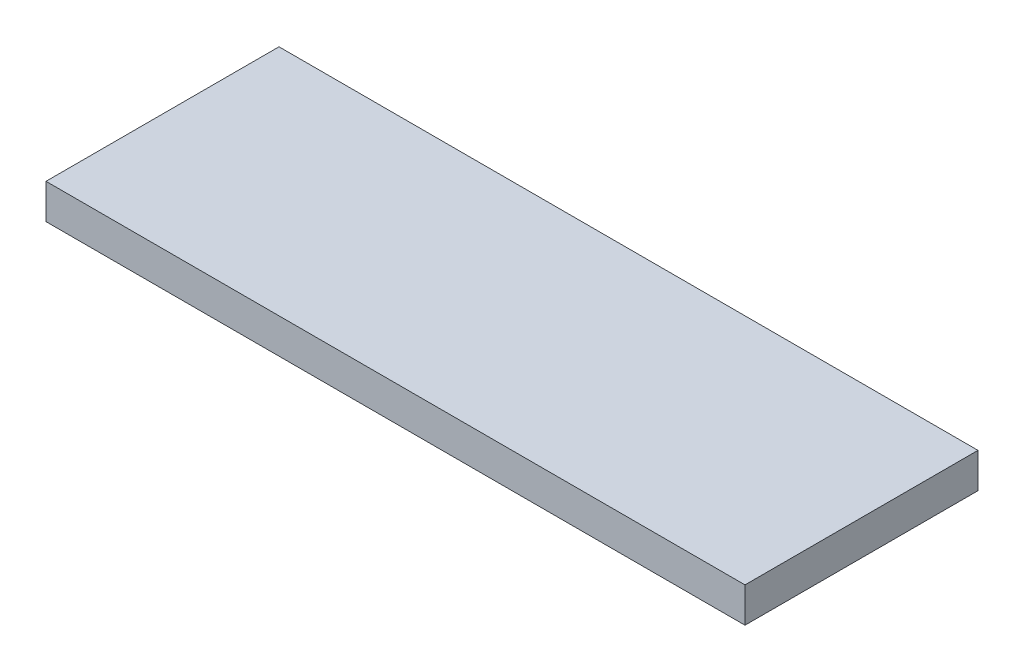
ISO-10303-21;
HEADER;
FILE_DESCRIPTION(('STEP AP214'),'2;1');
FILE_NAME('part.step','',(''),(''),'','','');
FILE_SCHEMA(('AUTOMOTIVE_DESIGN { 1 0 10303 214 1 1 1 1 }'));
ENDSEC;
DATA;
#1=APPLICATION_CONTEXT('core data for automotive mechanical design processes');
#2=APPLICATION_PROTOCOL_DEFINITION('international standard','automotive_design',2000,#1);
#3=PRODUCT_CONTEXT('',#1,'mechanical');
#4=PRODUCT('Part','Part','',(#3));
#5=PRODUCT_RELATED_PRODUCT_CATEGORY('part','',(#4));
#6=PRODUCT_DEFINITION_FORMATION('','',#4);
#7=PRODUCT_DEFINITION_CONTEXT('part definition',#1,'design');
#8=PRODUCT_DEFINITION('design','',#6,#7);
#9=PRODUCT_DEFINITION_SHAPE('','',#8);
#10=(LENGTH_UNIT() NAMED_UNIT(*) SI_UNIT(.MILLI.,.METRE.));
#11=(NAMED_UNIT(*) PLANE_ANGLE_UNIT() SI_UNIT($,.RADIAN.));
#12=(NAMED_UNIT(*) SI_UNIT($,.STERADIAN.) SOLID_ANGLE_UNIT());
#13=UNCERTAINTY_MEASURE_WITH_UNIT(LENGTH_MEASURE(1.E-05),#10,'distance_accuracy_value','');
#14=(GEOMETRIC_REPRESENTATION_CONTEXT(3) GLOBAL_UNCERTAINTY_ASSIGNED_CONTEXT((#13)) GLOBAL_UNIT_ASSIGNED_CONTEXT((#10,
#11,#12)) REPRESENTATION_CONTEXT('',''));
#15=CARTESIAN_POINT('',(0.,0.,0.));
#16=DIRECTION('',(0.,0.,1.));
#17=DIRECTION('',(1.,0.,0.));
#18=AXIS2_PLACEMENT_3D('',#15,#16,#17);
#19=CARTESIAN_POINT('',(0.,3.,0.));
#20=DIRECTION('',(1.,0.,0.));
#21=DIRECTION('',(0.,0.,-1.));
#22=AXIS2_PLACEMENT_3D('',#19,#20,#21);
#23=PLANE('',#22);
#24=DIRECTION('',(0.,0.,1.));
#25=VECTOR('',#24,1.);
#26=CARTESIAN_POINT('',(0.,0.,0.));
#27=LINE('',#26,#25);
#28=CARTESIAN_POINT('',(0.,0.,-20.));
#29=VERTEX_POINT('',#28);
#30=CARTESIAN_POINT('',(0.,0.,0.));
#31=VERTEX_POINT('',#30);
#32=EDGE_CURVE('E96',#29,#31,#27,.T.);
#33=ORIENTED_EDGE('',*,*,#32,.T.);
#34=DIRECTION('',(0.,-1.,0.));
#35=VECTOR('',#34,1.);
#36=CARTESIAN_POINT('',(0.,3.,0.));
#37=LINE('',#36,#35);
#38=CARTESIAN_POINT('',(0.,3.,0.));
#39=VERTEX_POINT('',#38);
#40=EDGE_CURVE('E11',#39,#31,#37,.T.);
#41=ORIENTED_EDGE('',*,*,#40,.F.);
#42=DIRECTION('',(0.,0.,1.));
#43=VECTOR('',#42,1.);
#44=CARTESIAN_POINT('',(0.,3.,0.));
#45=LINE('',#44,#43);
#46=CARTESIAN_POINT('',(0.,3.,-20.));
#47=VERTEX_POINT('',#46);
#48=EDGE_CURVE('E84',#47,#39,#45,.T.);
#49=ORIENTED_EDGE('',*,*,#48,.F.);
#50=DIRECTION('',(0.,-1.,0.));
#51=VECTOR('',#50,1.);
#52=CARTESIAN_POINT('',(0.,3.,-20.));
#53=LINE('',#52,#51);
#54=EDGE_CURVE('E92',#47,#29,#53,.T.);
#55=ORIENTED_EDGE('',*,*,#54,.T.);
#56=EDGE_LOOP('',(#33,#41,#49,#55));
#57=FACE_BOUND('',#56,.T.);
#58=ADVANCED_FACE('F33',(#57),#23,.F.);
#59=CARTESIAN_POINT('',(0.,3.,0.));
#60=DIRECTION('',(0.,0.,-1.));
#61=DIRECTION('',(-1.,0.,0.));
#62=AXIS2_PLACEMENT_3D('',#59,#60,#61);
#63=PLANE('',#62);
#64=DIRECTION('',(1.,0.,0.));
#65=VECTOR('',#64,1.);
#66=CARTESIAN_POINT('',(0.,0.,0.));
#67=LINE('',#66,#65);
#68=CARTESIAN_POINT('',(60.,0.,0.));
#69=VERTEX_POINT('',#68);
#70=EDGE_CURVE('E88',#31,#69,#67,.T.);
#71=ORIENTED_EDGE('',*,*,#70,.T.);
#72=DIRECTION('',(0.,-1.,0.));
#73=VECTOR('',#72,1.);
#74=CARTESIAN_POINT('',(60.,3.,0.));
#75=LINE('',#74,#73);
#76=CARTESIAN_POINT('',(60.,3.,0.));
#77=VERTEX_POINT('',#76);
#78=EDGE_CURVE('E41',#77,#69,#75,.T.);
#79=ORIENTED_EDGE('',*,*,#78,.F.);
#80=DIRECTION('',(1.,0.,0.));
#81=VECTOR('',#80,1.);
#82=CARTESIAN_POINT('',(0.,3.,0.));
#83=LINE('',#82,#81);
#84=EDGE_CURVE('E79',#39,#77,#83,.T.);
#85=ORIENTED_EDGE('',*,*,#84,.F.);
#86=ORIENTED_EDGE('',*,*,#40,.T.);
#87=EDGE_LOOP('',(#71,#79,#85,#86));
#88=FACE_BOUND('',#87,.T.);
#89=ADVANCED_FACE('F87',(#88),#63,.F.);
#90=CARTESIAN_POINT('',(60.,3.,0.));
#91=DIRECTION('',(-1.,0.,0.));
#92=DIRECTION('',(0.,0.,1.));
#93=AXIS2_PLACEMENT_3D('',#90,#91,#92);
#94=PLANE('',#93);
#95=DIRECTION('',(0.,0.,-1.));
#96=VECTOR('',#95,1.);
#97=CARTESIAN_POINT('',(60.,0.,0.));
#98=LINE('',#97,#96);
#99=CARTESIAN_POINT('',(60.,0.,-20.));
#100=VERTEX_POINT('',#99);
#101=EDGE_CURVE('E66',#69,#100,#98,.T.);
#102=ORIENTED_EDGE('',*,*,#101,.T.);
#103=DIRECTION('',(0.,-1.,0.));
#104=VECTOR('',#103,1.);
#105=CARTESIAN_POINT('',(60.,3.,-20.));
#106=LINE('',#105,#104);
#107=CARTESIAN_POINT('',(60.,3.,-20.));
#108=VERTEX_POINT('',#107);
#109=EDGE_CURVE('E89',#108,#100,#106,.T.);
#110=ORIENTED_EDGE('',*,*,#109,.F.);
#111=DIRECTION('',(0.,0.,-1.));
#112=VECTOR('',#111,1.);
#113=CARTESIAN_POINT('',(60.,3.,0.));
#114=LINE('',#113,#112);
#115=EDGE_CURVE('E82',#77,#108,#114,.T.);
#116=ORIENTED_EDGE('',*,*,#115,.F.);
#117=ORIENTED_EDGE('',*,*,#78,.T.);
#118=EDGE_LOOP('',(#102,#110,#116,#117));
#119=FACE_BOUND('',#118,.T.);
#120=ADVANCED_FACE('F90',(#119),#94,.F.);
#121=CARTESIAN_POINT('',(0.,3.,-20.));
#122=DIRECTION('',(0.,0.,1.));
#123=DIRECTION('',(1.,0.,0.));
#124=AXIS2_PLACEMENT_3D('',#121,#122,#123);
#125=PLANE('',#124);
#126=DIRECTION('',(-1.,0.,0.));
#127=VECTOR('',#126,1.);
#128=CARTESIAN_POINT('',(0.,0.,-20.));
#129=LINE('',#128,#127);
#130=EDGE_CURVE('E72',#100,#29,#129,.T.);
#131=ORIENTED_EDGE('',*,*,#130,.T.);
#132=ORIENTED_EDGE('',*,*,#54,.F.);
#133=DIRECTION('',(-1.,0.,0.));
#134=VECTOR('',#133,1.);
#135=CARTESIAN_POINT('',(0.,3.,-20.));
#136=LINE('',#135,#134);
#137=EDGE_CURVE('E49',#108,#47,#136,.T.);
#138=ORIENTED_EDGE('',*,*,#137,.F.);
#139=ORIENTED_EDGE('',*,*,#109,.T.);
#140=EDGE_LOOP('',(#131,#132,#138,#139));
#141=FACE_BOUND('',#140,.T.);
#142=ADVANCED_FACE('F103',(#141),#125,.F.);
#143=CARTESIAN_POINT('',(0.,3.,0.));
#144=DIRECTION('',(0.,-1.,0.));
#145=DIRECTION('',(0.,0.,-1.));
#146=AXIS2_PLACEMENT_3D('',#143,#144,#145);
#147=PLANE('',#146);
#148=ORIENTED_EDGE('',*,*,#48,.T.);
#149=ORIENTED_EDGE('',*,*,#84,.T.);
#150=ORIENTED_EDGE('',*,*,#115,.T.);
#151=ORIENTED_EDGE('',*,*,#137,.T.);
#152=EDGE_LOOP('',(#148,#149,#150,#151));
#153=FACE_BOUND('',#152,.T.);
#154=ADVANCED_FACE('F80',(#153),#147,.F.);
#155=CARTESIAN_POINT('',(0.,0.,0.));
#156=DIRECTION('',(0.,-1.,0.));
#157=DIRECTION('',(0.,0.,-1.));
#158=AXIS2_PLACEMENT_3D('',#155,#156,#157);
#159=PLANE('',#158);
#160=ORIENTED_EDGE('',*,*,#32,.F.);
#161=ORIENTED_EDGE('',*,*,#130,.F.);
#162=ORIENTED_EDGE('',*,*,#101,.F.);
#163=ORIENTED_EDGE('',*,*,#70,.F.);
#164=EDGE_LOOP('',(#160,#161,#162,#163));
#165=FACE_BOUND('',#164,.T.);
#166=ADVANCED_FACE('F106',(#165),#159,.T.);
#167=CLOSED_SHELL('',(#58,#89,#120,#142,#154,#166));
#168=MANIFOLD_SOLID_BREP('B2',#167);
#169=ADVANCED_BREP_SHAPE_REPRESENTATION('',(#18,#168),#14);
#170=SHAPE_DEFINITION_REPRESENTATION(#9,#169);
ENDSEC;
END-ISO-10303-21;
